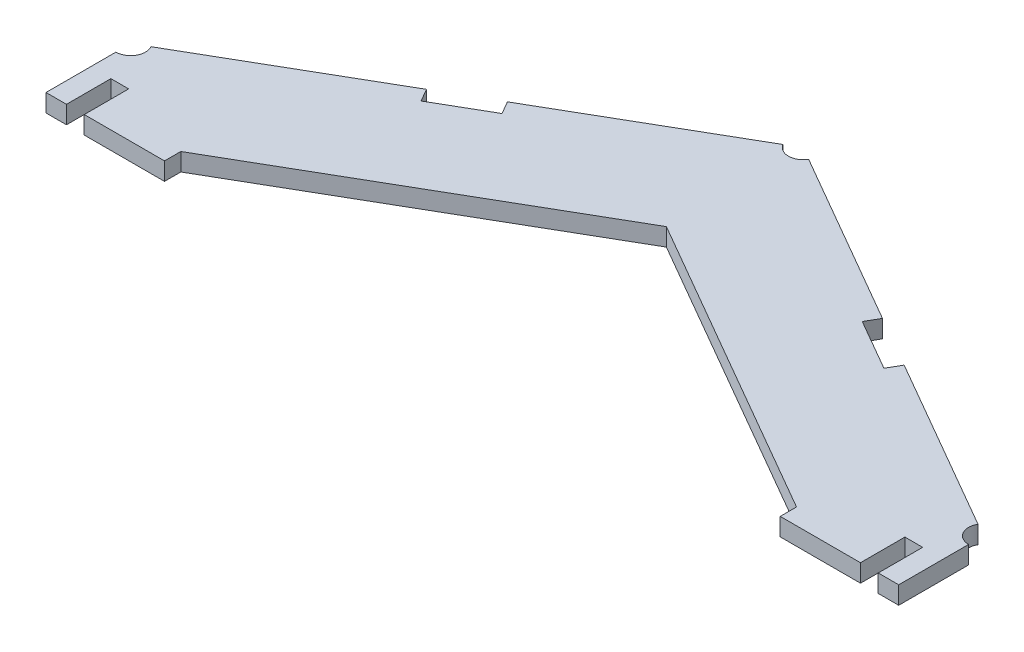
ISO-10303-21;
HEADER;
FILE_DESCRIPTION(('STEP AP214'),'2;1');
FILE_NAME('part.step','',(''),(''),'','','');
FILE_SCHEMA(('AUTOMOTIVE_DESIGN { 1 0 10303 214 1 1 1 1 }'));
ENDSEC;
DATA;
#1=APPLICATION_CONTEXT('core data for automotive mechanical design processes');
#2=APPLICATION_PROTOCOL_DEFINITION('international standard','automotive_design',2000,#1);
#3=PRODUCT_CONTEXT('',#1,'mechanical');
#4=PRODUCT('Part','Part','',(#3));
#5=PRODUCT_RELATED_PRODUCT_CATEGORY('part','',(#4));
#6=PRODUCT_DEFINITION_FORMATION('','',#4);
#7=PRODUCT_DEFINITION_CONTEXT('part definition',#1,'design');
#8=PRODUCT_DEFINITION('design','',#6,#7);
#9=PRODUCT_DEFINITION_SHAPE('','',#8);
#10=(LENGTH_UNIT() NAMED_UNIT(*) SI_UNIT(.MILLI.,.METRE.));
#11=(NAMED_UNIT(*) PLANE_ANGLE_UNIT() SI_UNIT($,.RADIAN.));
#12=(NAMED_UNIT(*) SI_UNIT($,.STERADIAN.) SOLID_ANGLE_UNIT());
#13=UNCERTAINTY_MEASURE_WITH_UNIT(LENGTH_MEASURE(1.E-05),#10,'distance_accuracy_value','');
#14=(GEOMETRIC_REPRESENTATION_CONTEXT(3) GLOBAL_UNCERTAINTY_ASSIGNED_CONTEXT((#13)) GLOBAL_UNIT_ASSIGNED_CONTEXT((#10,
#11,#12)) REPRESENTATION_CONTEXT('',''));
#15=CARTESIAN_POINT('',(0.,0.,0.));
#16=DIRECTION('',(0.,0.,1.));
#17=DIRECTION('',(1.,0.,0.));
#18=AXIS2_PLACEMENT_3D('',#15,#16,#17);
#19=CARTESIAN_POINT('',(-71.9715242270662,-36.,-27.25));
#20=DIRECTION('',(0.,-1.,0.));
#21=DIRECTION('',(0.,0.,-1.));
#22=AXIS2_PLACEMENT_3D('',#19,#20,#21);
#23=PLANE('',#22);
#24=DIRECTION('',(0.866025403784439,0.,0.5));
#25=VECTOR('',#24,1.);
#26=CARTESIAN_POINT('',(71.9615242270662,-36.,-41.5470053837925));
#27=LINE('',#26,#25);
#28=CARTESIAN_POINT('',(40.3108891324556,-36.,-59.8205080756885));
#29=VERTEX_POINT('',#28);
#30=CARTESIAN_POINT('',(69.7964607176053,-36.,-42.7970053837924));
#31=VERTEX_POINT('',#30);
#32=EDGE_CURVE('E468',#29,#31,#27,.T.);
#33=ORIENTED_EDGE('',*,*,#32,.F.);
#34=DIRECTION('',(0.500000000000006,0.,-0.866025403784435));
#35=VECTOR('',#34,1.);
#36=CARTESIAN_POINT('',(39.0608891324556,-36.,-57.6554445662274));
#37=LINE('',#36,#35);
#38=CARTESIAN_POINT('',(39.0608891324556,-36.,-57.6554445662274));
#39=VERTEX_POINT('',#38);
#40=EDGE_CURVE('E466',#39,#29,#37,.T.);
#41=ORIENTED_EDGE('',*,*,#40,.F.);
#42=DIRECTION('',(0.866025403784436,0.,0.500000000000005));
#43=VECTOR('',#42,1.);
#44=CARTESIAN_POINT('',(39.0608891324556,-36.,-57.6554445662274));
#45=LINE('',#44,#43);
#46=CARTESIAN_POINT('',(30.4006350946112,-36.,-62.6554445662274));
#47=VERTEX_POINT('',#46);
#48=EDGE_CURVE('E455',#47,#39,#45,.T.);
#49=ORIENTED_EDGE('',*,*,#48,.F.);
#50=DIRECTION('',(-0.500000000000005,0.,0.866025403784436));
#51=VECTOR('',#50,1.);
#52=CARTESIAN_POINT('',(30.4006350946112,-36.,-62.6554445662274));
#53=LINE('',#52,#51);
#54=CARTESIAN_POINT('',(31.6506350946112,-36.,-64.8205080756885));
#55=VERTEX_POINT('',#54);
#56=EDGE_CURVE('E462',#55,#47,#53,.T.);
#57=ORIENTED_EDGE('',*,*,#56,.F.);
#58=DIRECTION('',(0.866025403784439,0.,0.5));
#59=VECTOR('',#58,1.);
#60=CARTESIAN_POINT('',(71.9615242270662,-36.,-41.5470053837925));
#61=LINE('',#60,#59);
#62=CARTESIAN_POINT('',(2.1650635094611,-36.,-81.8440107675849));
#63=VERTEX_POINT('',#62);
#64=EDGE_CURVE('E464',#63,#55,#61,.T.);
#65=ORIENTED_EDGE('',*,*,#64,.F.);
#66=CARTESIAN_POINT('',(0.,-36.,-83.0940107675849));
#67=DIRECTION('',(0.,-1.,0.));
#68=DIRECTION('',(0.,0.,-1.));
#69=AXIS2_PLACEMENT_3D('',#66,#67,#68);
#70=CIRCLE('',#69,2.5);
#71=CARTESIAN_POINT('',(-2.16506350946109,-36.,-81.8440107675849));
#72=VERTEX_POINT('',#71);
#73=EDGE_CURVE('E473',#72,#63,#70,.F.);
#74=ORIENTED_EDGE('',*,*,#73,.F.);
#75=DIRECTION('',(0.866025403784439,0.,-0.5));
#76=VECTOR('',#75,1.);
#77=CARTESIAN_POINT('',(0.,-36.,-83.0940107675849));
#78=LINE('',#77,#76);
#79=CARTESIAN_POINT('',(-31.6506350946108,-36.,-64.8205080756888));
#80=VERTEX_POINT('',#79);
#81=EDGE_CURVE('E475',#80,#72,#78,.T.);
#82=ORIENTED_EDGE('',*,*,#81,.F.);
#83=DIRECTION('',(-0.499999999999999,0.,-0.866025403784439));
#84=VECTOR('',#83,1.);
#85=CARTESIAN_POINT('',(-30.4006350946108,-36.,-62.6554445662276));
#86=LINE('',#85,#84);
#87=CARTESIAN_POINT('',(-30.4006350946108,-36.,-62.6554445662276));
#88=VERTEX_POINT('',#87);
#89=EDGE_CURVE('E477',#88,#80,#86,.T.);
#90=ORIENTED_EDGE('',*,*,#89,.F.);
#91=DIRECTION('',(0.86602540378444,0.,-0.499999999999998));
#92=VECTOR('',#91,1.);
#93=CARTESIAN_POINT('',(-30.4006350946108,-36.,-62.6554445662276));
#94=LINE('',#93,#92);
#95=CARTESIAN_POINT('',(-39.0608891324552,-36.,-57.6554445662277));
#96=VERTEX_POINT('',#95);
#97=EDGE_CURVE('E479',#96,#88,#94,.T.);
#98=ORIENTED_EDGE('',*,*,#97,.F.);
#99=DIRECTION('',(0.499999999999999,0.,0.866025403784439));
#100=VECTOR('',#99,1.);
#101=CARTESIAN_POINT('',(-39.0608891324552,-36.,-57.6554445662277));
#102=LINE('',#101,#100);
#103=CARTESIAN_POINT('',(-40.3108891324552,-36.,-59.8205080756888));
#104=VERTEX_POINT('',#103);
#105=EDGE_CURVE('E481',#104,#96,#102,.T.);
#106=ORIENTED_EDGE('',*,*,#105,.F.);
#107=DIRECTION('',(0.866025403784439,0.,-0.5));
#108=VECTOR('',#107,1.);
#109=CARTESIAN_POINT('',(0.,-36.,-83.0940107675849));
#110=LINE('',#109,#108);
#111=CARTESIAN_POINT('',(-69.7964607176044,-36.,-42.7970053837929));
#112=VERTEX_POINT('',#111);
#113=EDGE_CURVE('E483',#112,#104,#110,.T.);
#114=ORIENTED_EDGE('',*,*,#113,.F.);
#115=CARTESIAN_POINT('',(-71.9615242270657,-36.,-41.5470053837933));
#116=DIRECTION('',(0.,-1.,0.));
#117=DIRECTION('',(0.,0.,-1.));
#118=AXIS2_PLACEMENT_3D('',#115,#116,#117);
#119=CIRCLE('',#118,2.5);
#120=CARTESIAN_POINT('',(-71.9615242270662,-36.,-39.0470053837933));
#121=VERTEX_POINT('',#120);
#122=EDGE_CURVE('E485',#121,#112,#119,.F.);
#123=ORIENTED_EDGE('',*,*,#122,.F.);
#124=DIRECTION('',(0.,0.,-1.));
#125=VECTOR('',#124,1.);
#126=CARTESIAN_POINT('',(-71.9615242270662,-36.,-41.5470053837925));
#127=LINE('',#126,#125);
#128=CARTESIAN_POINT('',(-71.9615242270662,-36.,-27.25));
#129=VERTEX_POINT('',#128);
#130=EDGE_CURVE('E334',#129,#121,#127,.T.);
#131=ORIENTED_EDGE('',*,*,#130,.F.);
#132=DIRECTION('',(1.,0.,0.));
#133=VECTOR('',#132,1.);
#134=CARTESIAN_POINT('',(-113.272742430532,-36.,-27.25));
#135=LINE('',#134,#133);
#136=CARTESIAN_POINT('',(-68.5064315060166,-36.,-27.25));
#137=VERTEX_POINT('',#136);
#138=EDGE_CURVE('E381',#129,#137,#135,.T.);
#139=ORIENTED_EDGE('',*,*,#138,.T.);
#140=DIRECTION('',(0.,0.,1.));
#141=VECTOR('',#140,1.);
#142=CARTESIAN_POINT('',(-68.5064315060166,-36.,-34.75));
#143=LINE('',#142,#141);
#144=CARTESIAN_POINT('',(-68.5064315060166,-36.,-34.75));
#145=VERTEX_POINT('',#144);
#146=EDGE_CURVE('E411',#145,#137,#143,.T.);
#147=ORIENTED_EDGE('',*,*,#146,.F.);
#148=DIRECTION('',(-1.,0.,0.));
#149=VECTOR('',#148,1.);
#150=CARTESIAN_POINT('',(-68.5064315060166,-36.,-34.75));
#151=LINE('',#150,#149);
#152=CARTESIAN_POINT('',(-65.5064315060166,-36.,-34.75));
#153=VERTEX_POINT('',#152);
#154=EDGE_CURVE('E414',#153,#145,#151,.T.);
#155=ORIENTED_EDGE('',*,*,#154,.F.);
#156=DIRECTION('',(0.,0.,-1.));
#157=VECTOR('',#156,1.);
#158=CARTESIAN_POINT('',(-65.5064315060166,-36.,-34.75));
#159=LINE('',#158,#157);
#160=CARTESIAN_POINT('',(-65.5064315060166,-36.,-27.25));
#161=VERTEX_POINT('',#160);
#162=EDGE_CURVE('E67',#161,#153,#159,.T.);
#163=ORIENTED_EDGE('',*,*,#162,.F.);
#164=DIRECTION('',(1.,0.,0.));
#165=VECTOR('',#164,1.);
#166=CARTESIAN_POINT('',(-113.272742430532,-36.,-27.25));
#167=LINE('',#166,#165);
#168=CARTESIAN_POINT('',(-51.9615242270664,-36.,-27.25));
#169=VERTEX_POINT('',#168);
#170=EDGE_CURVE('E60',#161,#169,#167,.T.);
#171=ORIENTED_EDGE('',*,*,#170,.T.);
#172=DIRECTION('',(0.,0.,-1.));
#173=VECTOR('',#172,1.);
#174=CARTESIAN_POINT('',(-51.9615242270663,-36.,29.9999999999999));
#175=LINE('',#174,#173);
#176=CARTESIAN_POINT('',(-51.9615242270664,-36.,-29.9999999999999));
#177=VERTEX_POINT('',#176);
#178=EDGE_CURVE('E285',#169,#177,#175,.T.);
#179=ORIENTED_EDGE('',*,*,#178,.T.);
#180=DIRECTION('',(0.866025403784439,0.,-0.499999999999999));
#181=VECTOR('',#180,1.);
#182=CARTESIAN_POINT('',(-51.9615242270664,-36.,-29.9999999999999));
#183=LINE('',#182,#181);
#184=CARTESIAN_POINT('',(0.,-36.,-59.9999999999999));
#185=VERTEX_POINT('',#184);
#186=EDGE_CURVE('E390',#177,#185,#183,.T.);
#187=ORIENTED_EDGE('',*,*,#186,.T.);
#188=DIRECTION('',(0.866025403784438,0.,0.500000000000001));
#189=VECTOR('',#188,1.);
#190=CARTESIAN_POINT('',(0.,-36.,-59.9999999999999));
#191=LINE('',#190,#189);
#192=CARTESIAN_POINT('',(51.9615242270662,-36.,-29.9999999999998));
#193=VERTEX_POINT('',#192);
#194=EDGE_CURVE('E392',#185,#193,#191,.T.);
#195=ORIENTED_EDGE('',*,*,#194,.T.);
#196=DIRECTION('',(0.,0.,1.));
#197=VECTOR('',#196,1.);
#198=CARTESIAN_POINT('',(51.9615242270662,-36.,-29.9999999999998));
#199=LINE('',#198,#197);
#200=CARTESIAN_POINT('',(51.9615242270662,-36.,-27.25));
#201=VERTEX_POINT('',#200);
#202=EDGE_CURVE('E47',#193,#201,#199,.T.);
#203=ORIENTED_EDGE('',*,*,#202,.T.);
#204=DIRECTION('',(1.,0.,0.));
#205=VECTOR('',#204,1.);
#206=CARTESIAN_POINT('',(-113.272742430532,-36.,-27.25));
#207=LINE('',#206,#205);
#208=CARTESIAN_POINT('',(65.5064315060166,-36.,-27.25));
#209=VERTEX_POINT('',#208);
#210=EDGE_CURVE('E384',#201,#209,#207,.T.);
#211=ORIENTED_EDGE('',*,*,#210,.T.);
#212=DIRECTION('',(0.,0.,1.));
#213=VECTOR('',#212,1.);
#214=CARTESIAN_POINT('',(65.5064315060166,-36.,-34.75));
#215=LINE('',#214,#213);
#216=CARTESIAN_POINT('',(65.5064315060166,-36.,-34.75));
#217=VERTEX_POINT('',#216);
#218=EDGE_CURVE('E409',#217,#209,#215,.T.);
#219=ORIENTED_EDGE('',*,*,#218,.F.);
#220=DIRECTION('',(-1.,0.,0.));
#221=VECTOR('',#220,1.);
#222=CARTESIAN_POINT('',(68.5064315060166,-36.,-34.75));
#223=LINE('',#222,#221);
#224=CARTESIAN_POINT('',(68.5064315060166,-36.,-34.75));
#225=VERTEX_POINT('',#224);
#226=EDGE_CURVE('E416',#225,#217,#223,.T.);
#227=ORIENTED_EDGE('',*,*,#226,.F.);
#228=DIRECTION('',(0.,0.,-1.));
#229=VECTOR('',#228,1.);
#230=CARTESIAN_POINT('',(68.5064315060166,-36.,-34.75));
#231=LINE('',#230,#229);
#232=CARTESIAN_POINT('',(68.5064315060166,-36.,-27.25));
#233=VERTEX_POINT('',#232);
#234=EDGE_CURVE('E412',#233,#225,#231,.T.);
#235=ORIENTED_EDGE('',*,*,#234,.F.);
#236=DIRECTION('',(1.,0.,0.));
#237=VECTOR('',#236,1.);
#238=CARTESIAN_POINT('',(-113.272742430532,-36.,-27.25));
#239=LINE('',#238,#237);
#240=CARTESIAN_POINT('',(71.9615242270662,-36.,-27.25));
#241=VERTEX_POINT('',#240);
#242=EDGE_CURVE('E327',#233,#241,#239,.T.);
#243=ORIENTED_EDGE('',*,*,#242,.T.);
#244=DIRECTION('',(0.,0.,1.));
#245=VECTOR('',#244,1.);
#246=CARTESIAN_POINT('',(71.9615242270662,-36.,41.5470053837925));
#247=LINE('',#246,#245);
#248=CARTESIAN_POINT('',(71.9615242270662,-36.,-39.0470053837923));
#249=VERTEX_POINT('',#248);
#250=EDGE_CURVE('E342',#249,#241,#247,.T.);
#251=ORIENTED_EDGE('',*,*,#250,.F.);
#252=CARTESIAN_POINT('',(71.9615242270663,-36.,-41.5470053837923));
#253=DIRECTION('',(0.,-1.,0.));
#254=DIRECTION('',(0.,0.,-1.));
#255=AXIS2_PLACEMENT_3D('',#252,#253,#254);
#256=CIRCLE('',#255,2.5);
#257=EDGE_CURVE('E252',#31,#249,#256,.F.);
#258=ORIENTED_EDGE('',*,*,#257,.F.);
#259=EDGE_LOOP('',(#33,#41,#49,#57,#65,#74,#82,#90,#98,#106,#114,#123,#131,#139,#147,#155,#163,
#171,#179,#187,#195,#203,#211,#219,#227,#235,#243,#251,#258));
#260=FACE_BOUND('',#259,.T.);
#261=ADVANCED_FACE('F43',(#260),#23,.F.);
#262=CARTESIAN_POINT('',(-71.9715242270662,-39.,-27.25));
#263=DIRECTION('',(0.,-1.,0.));
#264=DIRECTION('',(0.,0.,-1.));
#265=AXIS2_PLACEMENT_3D('',#262,#263,#264);
#266=PLANE('',#265);
#267=DIRECTION('',(0.866025403784439,0.,0.5));
#268=VECTOR('',#267,1.);
#269=CARTESIAN_POINT('',(71.9615242270662,-39.,-41.5470053837925));
#270=LINE('',#269,#268);
#271=CARTESIAN_POINT('',(40.3108891324556,-39.,-59.8205080756885));
#272=VERTEX_POINT('',#271);
#273=CARTESIAN_POINT('',(69.7964607176053,-39.,-42.7970053837924));
#274=VERTEX_POINT('',#273);
#275=EDGE_CURVE('E318',#272,#274,#270,.T.);
#276=ORIENTED_EDGE('',*,*,#275,.T.);
#277=CARTESIAN_POINT('',(71.9615242270663,-39.,-41.5470053837923));
#278=DIRECTION('',(0.,-1.,0.));
#279=DIRECTION('',(0.,0.,-1.));
#280=AXIS2_PLACEMENT_3D('',#277,#278,#279);
#281=CIRCLE('',#280,2.5);
#282=CARTESIAN_POINT('',(71.9615242270662,-39.,-39.0470053837923));
#283=VERTEX_POINT('',#282);
#284=EDGE_CURVE('E320',#274,#283,#281,.F.);
#285=ORIENTED_EDGE('',*,*,#284,.T.);
#286=DIRECTION('',(0.,0.,1.));
#287=VECTOR('',#286,1.);
#288=CARTESIAN_POINT('',(71.9615242270662,-39.,41.5470053837925));
#289=LINE('',#288,#287);
#290=CARTESIAN_POINT('',(71.9615242270662,-39.,-27.25));
#291=VERTEX_POINT('',#290);
#292=EDGE_CURVE('E278',#283,#291,#289,.T.);
#293=ORIENTED_EDGE('',*,*,#292,.T.);
#294=DIRECTION('',(1.,0.,0.));
#295=VECTOR('',#294,1.);
#296=CARTESIAN_POINT('',(-113.272742430532,-39.,-27.25));
#297=LINE('',#296,#295);
#298=CARTESIAN_POINT('',(68.5064315060166,-39.,-27.25));
#299=VERTEX_POINT('',#298);
#300=EDGE_CURVE('E323',#299,#291,#297,.T.);
#301=ORIENTED_EDGE('',*,*,#300,.F.);
#302=DIRECTION('',(0.,0.,-1.));
#303=VECTOR('',#302,1.);
#304=CARTESIAN_POINT('',(68.5064315060166,-39.,-34.75));
#305=LINE('',#304,#303);
#306=CARTESIAN_POINT('',(68.5064315060166,-39.,-34.75));
#307=VERTEX_POINT('',#306);
#308=EDGE_CURVE('E272',#299,#307,#305,.T.);
#309=ORIENTED_EDGE('',*,*,#308,.T.);
#310=DIRECTION('',(-1.,0.,0.));
#311=VECTOR('',#310,1.);
#312=CARTESIAN_POINT('',(68.5064315060166,-39.,-34.75));
#313=LINE('',#312,#311);
#314=CARTESIAN_POINT('',(65.5064315060166,-39.,-34.75));
#315=VERTEX_POINT('',#314);
#316=EDGE_CURVE('E275',#307,#315,#313,.T.);
#317=ORIENTED_EDGE('',*,*,#316,.T.);
#318=DIRECTION('',(0.,0.,1.));
#319=VECTOR('',#318,1.);
#320=CARTESIAN_POINT('',(65.5064315060166,-39.,-34.75));
#321=LINE('',#320,#319);
#322=CARTESIAN_POINT('',(65.5064315060166,-39.,-27.25));
#323=VERTEX_POINT('',#322);
#324=EDGE_CURVE('E269',#315,#323,#321,.T.);
#325=ORIENTED_EDGE('',*,*,#324,.T.);
#326=DIRECTION('',(1.,0.,0.));
#327=VECTOR('',#326,1.);
#328=CARTESIAN_POINT('',(-113.272742430532,-39.,-27.25));
#329=LINE('',#328,#327);
#330=CARTESIAN_POINT('',(51.9615242270662,-39.,-27.25));
#331=VERTEX_POINT('',#330);
#332=EDGE_CURVE('E253',#331,#323,#329,.T.);
#333=ORIENTED_EDGE('',*,*,#332,.F.);
#334=DIRECTION('',(0.,0.,1.));
#335=VECTOR('',#334,1.);
#336=CARTESIAN_POINT('',(51.9615242270662,-39.,-29.9999999999998));
#337=LINE('',#336,#335);
#338=CARTESIAN_POINT('',(51.9615242270662,-39.,-29.9999999999998));
#339=VERTEX_POINT('',#338);
#340=EDGE_CURVE('E340',#339,#331,#337,.T.);
#341=ORIENTED_EDGE('',*,*,#340,.F.);
#342=DIRECTION('',(0.866025403784438,0.,0.500000000000001));
#343=VECTOR('',#342,1.);
#344=CARTESIAN_POINT('',(0.,-39.,-59.9999999999999));
#345=LINE('',#344,#343);
#346=CARTESIAN_POINT('',(0.,-39.,-59.9999999999999));
#347=VERTEX_POINT('',#346);
#348=EDGE_CURVE('E337',#347,#339,#345,.T.);
#349=ORIENTED_EDGE('',*,*,#348,.F.);
#350=DIRECTION('',(0.866025403784439,0.,-0.499999999999999));
#351=VECTOR('',#350,1.);
#352=CARTESIAN_POINT('',(-51.9615242270664,-39.,-29.9999999999999));
#353=LINE('',#352,#351);
#354=CARTESIAN_POINT('',(-51.9615242270664,-39.,-29.9999999999999));
#355=VERTEX_POINT('',#354);
#356=EDGE_CURVE('E333',#355,#347,#353,.T.);
#357=ORIENTED_EDGE('',*,*,#356,.F.);
#358=DIRECTION('',(0.,0.,-1.));
#359=VECTOR('',#358,1.);
#360=CARTESIAN_POINT('',(-51.9615242270663,-39.,29.9999999999999));
#361=LINE('',#360,#359);
#362=CARTESIAN_POINT('',(-51.9615242270664,-39.,-27.25));
#363=VERTEX_POINT('',#362);
#364=EDGE_CURVE('E251',#363,#355,#361,.T.);
#365=ORIENTED_EDGE('',*,*,#364,.F.);
#366=DIRECTION('',(1.,0.,0.));
#367=VECTOR('',#366,1.);
#368=CARTESIAN_POINT('',(-113.272742430532,-39.,-27.25));
#369=LINE('',#368,#367);
#370=CARTESIAN_POINT('',(-65.5064315060166,-39.,-27.25));
#371=VERTEX_POINT('',#370);
#372=EDGE_CURVE('E238',#371,#363,#369,.T.);
#373=ORIENTED_EDGE('',*,*,#372,.F.);
#374=DIRECTION('',(0.,0.,-1.));
#375=VECTOR('',#374,1.);
#376=CARTESIAN_POINT('',(-65.5064315060166,-39.,-34.75));
#377=LINE('',#376,#375);
#378=CARTESIAN_POINT('',(-65.5064315060166,-39.,-34.75));
#379=VERTEX_POINT('',#378);
#380=EDGE_CURVE('E249',#371,#379,#377,.T.);
#381=ORIENTED_EDGE('',*,*,#380,.T.);
#382=DIRECTION('',(-1.,0.,0.));
#383=VECTOR('',#382,1.);
#384=CARTESIAN_POINT('',(-68.5064315060166,-39.,-34.75));
#385=LINE('',#384,#383);
#386=CARTESIAN_POINT('',(-68.5064315060166,-39.,-34.75));
#387=VERTEX_POINT('',#386);
#388=EDGE_CURVE('E259',#379,#387,#385,.T.);
#389=ORIENTED_EDGE('',*,*,#388,.T.);
#390=DIRECTION('',(0.,0.,1.));
#391=VECTOR('',#390,1.);
#392=CARTESIAN_POINT('',(-68.5064315060166,-39.,-34.75));
#393=LINE('',#392,#391);
#394=CARTESIAN_POINT('',(-68.5064315060166,-39.,-27.25));
#395=VERTEX_POINT('',#394);
#396=EDGE_CURVE('E261',#387,#395,#393,.T.);
#397=ORIENTED_EDGE('',*,*,#396,.T.);
#398=DIRECTION('',(1.,0.,0.));
#399=VECTOR('',#398,1.);
#400=CARTESIAN_POINT('',(-113.272742430532,-39.,-27.25));
#401=LINE('',#400,#399);
#402=CARTESIAN_POINT('',(-71.9615242270662,-39.,-27.25));
#403=VERTEX_POINT('',#402);
#404=EDGE_CURVE('E326',#403,#395,#401,.T.);
#405=ORIENTED_EDGE('',*,*,#404,.F.);
#406=DIRECTION('',(0.,0.,-1.));
#407=VECTOR('',#406,1.);
#408=CARTESIAN_POINT('',(-71.9615242270662,-39.,-41.5470053837925));
#409=LINE('',#408,#407);
#410=CARTESIAN_POINT('',(-71.9615242270662,-39.,-39.0470053837933));
#411=VERTEX_POINT('',#410);
#412=EDGE_CURVE('E281',#403,#411,#409,.T.);
#413=ORIENTED_EDGE('',*,*,#412,.T.);
#414=CARTESIAN_POINT('',(-71.9615242270657,-39.,-41.5470053837933));
#415=DIRECTION('',(0.,-1.,0.));
#416=DIRECTION('',(0.,0.,-1.));
#417=AXIS2_PLACEMENT_3D('',#414,#415,#416);
#418=CIRCLE('',#417,2.5);
#419=CARTESIAN_POINT('',(-69.7964607176044,-39.,-42.7970053837929));
#420=VERTEX_POINT('',#419);
#421=EDGE_CURVE('E284',#411,#420,#418,.F.);
#422=ORIENTED_EDGE('',*,*,#421,.T.);
#423=DIRECTION('',(0.866025403784439,0.,-0.5));
#424=VECTOR('',#423,1.);
#425=CARTESIAN_POINT('',(0.,-39.,-83.0940107675849));
#426=LINE('',#425,#424);
#427=CARTESIAN_POINT('',(-40.3108891324552,-39.,-59.8205080756888));
#428=VERTEX_POINT('',#427);
#429=EDGE_CURVE('E288',#420,#428,#426,.T.);
#430=ORIENTED_EDGE('',*,*,#429,.T.);
#431=DIRECTION('',(0.499999999999999,0.,0.866025403784439));
#432=VECTOR('',#431,1.);
#433=CARTESIAN_POINT('',(-39.0608891324552,-39.,-57.6554445662277));
#434=LINE('',#433,#432);
#435=CARTESIAN_POINT('',(-39.0608891324552,-39.,-57.6554445662277));
#436=VERTEX_POINT('',#435);
#437=EDGE_CURVE('E291',#428,#436,#434,.T.);
#438=ORIENTED_EDGE('',*,*,#437,.T.);
#439=DIRECTION('',(0.86602540378444,0.,-0.499999999999998));
#440=VECTOR('',#439,1.);
#441=CARTESIAN_POINT('',(-30.4006350946108,-39.,-62.6554445662276));
#442=LINE('',#441,#440);
#443=CARTESIAN_POINT('',(-30.4006350946108,-39.,-62.6554445662276));
#444=VERTEX_POINT('',#443);
#445=EDGE_CURVE('E294',#436,#444,#442,.T.);
#446=ORIENTED_EDGE('',*,*,#445,.T.);
#447=DIRECTION('',(-0.499999999999999,0.,-0.866025403784439));
#448=VECTOR('',#447,1.);
#449=CARTESIAN_POINT('',(-30.4006350946108,-39.,-62.6554445662276));
#450=LINE('',#449,#448);
#451=CARTESIAN_POINT('',(-31.6506350946108,-39.,-64.8205080756888));
#452=VERTEX_POINT('',#451);
#453=EDGE_CURVE('E297',#444,#452,#450,.T.);
#454=ORIENTED_EDGE('',*,*,#453,.T.);
#455=DIRECTION('',(0.866025403784439,0.,-0.5));
#456=VECTOR('',#455,1.);
#457=CARTESIAN_POINT('',(0.,-39.,-83.0940107675849));
#458=LINE('',#457,#456);
#459=CARTESIAN_POINT('',(-2.16506350946109,-39.,-81.8440107675849));
#460=VERTEX_POINT('',#459);
#461=EDGE_CURVE('E300',#452,#460,#458,.T.);
#462=ORIENTED_EDGE('',*,*,#461,.T.);
#463=CARTESIAN_POINT('',(0.,-39.,-83.0940107675849));
#464=DIRECTION('',(0.,-1.,0.));
#465=DIRECTION('',(0.,0.,-1.));
#466=AXIS2_PLACEMENT_3D('',#463,#464,#465);
#467=CIRCLE('',#466,2.5);
#468=CARTESIAN_POINT('',(2.1650635094611,-39.,-81.8440107675849));
#469=VERTEX_POINT('',#468);
#470=EDGE_CURVE('E303',#460,#469,#467,.F.);
#471=ORIENTED_EDGE('',*,*,#470,.T.);
#472=DIRECTION('',(0.866025403784439,0.,0.5));
#473=VECTOR('',#472,1.);
#474=CARTESIAN_POINT('',(71.9615242270662,-39.,-41.5470053837925));
#475=LINE('',#474,#473);
#476=CARTESIAN_POINT('',(31.6506350946112,-39.,-64.8205080756885));
#477=VERTEX_POINT('',#476);
#478=EDGE_CURVE('E306',#469,#477,#475,.T.);
#479=ORIENTED_EDGE('',*,*,#478,.T.);
#480=DIRECTION('',(-0.500000000000005,0.,0.866025403784436));
#481=VECTOR('',#480,1.);
#482=CARTESIAN_POINT('',(30.4006350946112,-39.,-62.6554445662274));
#483=LINE('',#482,#481);
#484=CARTESIAN_POINT('',(30.4006350946112,-39.,-62.6554445662274));
#485=VERTEX_POINT('',#484);
#486=EDGE_CURVE('E309',#477,#485,#483,.T.);
#487=ORIENTED_EDGE('',*,*,#486,.T.);
#488=DIRECTION('',(0.866025403784436,0.,0.500000000000005));
#489=VECTOR('',#488,1.);
#490=CARTESIAN_POINT('',(39.0608891324556,-39.,-57.6554445662274));
#491=LINE('',#490,#489);
#492=CARTESIAN_POINT('',(39.0608891324556,-39.,-57.6554445662274));
#493=VERTEX_POINT('',#492);
#494=EDGE_CURVE('E312',#485,#493,#491,.T.);
#495=ORIENTED_EDGE('',*,*,#494,.T.);
#496=DIRECTION('',(0.500000000000006,0.,-0.866025403784435));
#497=VECTOR('',#496,1.);
#498=CARTESIAN_POINT('',(39.0608891324556,-39.,-57.6554445662274));
#499=LINE('',#498,#497);
#500=EDGE_CURVE('E315',#493,#272,#499,.T.);
#501=ORIENTED_EDGE('',*,*,#500,.T.);
#502=EDGE_LOOP('',(#276,#285,#293,#301,#309,#317,#325,#333,#341,#349,#357,#365,#373,#381,#389,
#397,#405,#413,#422,#430,#438,#446,#454,#462,#471,#479,#487,#495,#501));
#503=FACE_BOUND('',#502,.T.);
#504=ADVANCED_FACE('F247',(#503),#266,.T.);
#505=CARTESIAN_POINT('',(71.9615242270662,9.,-41.5470053837925));
#506=DIRECTION('',(-0.5,0.,0.866025403784439));
#507=DIRECTION('',(0.866025403784439,0.,0.5));
#508=AXIS2_PLACEMENT_3D('',#505,#506,#507);
#509=PLANE('',#508);
#510=DIRECTION('',(0.,1.,0.));
#511=VECTOR('',#510,1.);
#512=CARTESIAN_POINT('',(40.3108891324556,9.,-59.8205080756885));
#513=LINE('',#512,#511);
#514=EDGE_CURVE('E366',#272,#29,#513,.T.);
#515=ORIENTED_EDGE('',*,*,#514,.T.);
#516=ORIENTED_EDGE('',*,*,#32,.T.);
#517=DIRECTION('',(0.,1.,0.));
#518=VECTOR('',#517,1.);
#519=CARTESIAN_POINT('',(69.7964607176053,-41.,-42.7970053837924));
#520=LINE('',#519,#518);
#521=EDGE_CURVE('E361',#31,#274,#520,.F.);
#522=ORIENTED_EDGE('',*,*,#521,.T.);
#523=ORIENTED_EDGE('',*,*,#275,.F.);
#524=EDGE_LOOP('',(#515,#516,#522,#523));
#525=FACE_BOUND('',#524,.T.);
#526=ADVANCED_FACE('F525',(#525),#509,.F.);
#527=CARTESIAN_POINT('',(39.0608891324556,-41.,-57.6554445662274));
#528=DIRECTION('',(0.866025403784435,0.,0.500000000000006));
#529=DIRECTION('',(0.500000000000006,0.,-0.866025403784435));
#530=AXIS2_PLACEMENT_3D('',#527,#528,#529);
#531=PLANE('',#530);
#532=DIRECTION('',(0.,1.,0.));
#533=VECTOR('',#532,1.);
#534=CARTESIAN_POINT('',(39.0608891324556,-41.,-57.6554445662274));
#535=LINE('',#534,#533);
#536=EDGE_CURVE('E446',#493,#39,#535,.T.);
#537=ORIENTED_EDGE('',*,*,#536,.T.);
#538=ORIENTED_EDGE('',*,*,#40,.T.);
#539=ORIENTED_EDGE('',*,*,#514,.F.);
#540=ORIENTED_EDGE('',*,*,#500,.F.);
#541=EDGE_LOOP('',(#537,#538,#539,#540));
#542=FACE_BOUND('',#541,.T.);
#543=ADVANCED_FACE('F533',(#542),#531,.F.);
#544=CARTESIAN_POINT('',(39.0608891324556,-41.,-57.6554445662274));
#545=DIRECTION('',(-0.500000000000005,0.,0.866025403784436));
#546=DIRECTION('',(0.866025403784436,0.,0.500000000000005));
#547=AXIS2_PLACEMENT_3D('',#544,#545,#546);
#548=PLANE('',#547);
#549=DIRECTION('',(0.,1.,0.));
#550=VECTOR('',#549,1.);
#551=CARTESIAN_POINT('',(30.4006350946112,-41.,-62.6554445662274));
#552=LINE('',#551,#550);
#553=EDGE_CURVE('E264',#485,#47,#552,.T.);
#554=ORIENTED_EDGE('',*,*,#553,.T.);
#555=ORIENTED_EDGE('',*,*,#48,.T.);
#556=ORIENTED_EDGE('',*,*,#536,.F.);
#557=ORIENTED_EDGE('',*,*,#494,.F.);
#558=EDGE_LOOP('',(#554,#555,#556,#557));
#559=FACE_BOUND('',#558,.T.);
#560=ADVANCED_FACE('F453',(#559),#548,.F.);
#561=CARTESIAN_POINT('',(30.4006350946112,-41.,-62.6554445662274));
#562=DIRECTION('',(-0.866025403784436,0.,-0.500000000000005));
#563=DIRECTION('',(-0.500000000000005,0.,0.866025403784436));
#564=AXIS2_PLACEMENT_3D('',#561,#562,#563);
#565=PLANE('',#564);
#566=DIRECTION('',(0.,-1.,0.));
#567=VECTOR('',#566,1.);
#568=CARTESIAN_POINT('',(31.6506350946112,9.,-64.8205080756885));
#569=LINE('',#568,#567);
#570=EDGE_CURVE('E364',#55,#477,#569,.T.);
#571=ORIENTED_EDGE('',*,*,#570,.F.);
#572=ORIENTED_EDGE('',*,*,#56,.T.);
#573=ORIENTED_EDGE('',*,*,#553,.F.);
#574=ORIENTED_EDGE('',*,*,#486,.F.);
#575=EDGE_LOOP('',(#571,#572,#573,#574));
#576=FACE_BOUND('',#575,.T.);
#577=ADVANCED_FACE('F460',(#576),#565,.F.);
#578=DIRECTION('',(0.,1.,0.));
#579=VECTOR('',#578,1.);
#580=CARTESIAN_POINT('',(2.1650635094611,-41.,-81.8440107675849));
#581=LINE('',#580,#579);
#582=EDGE_CURVE('E355',#469,#63,#581,.T.);
#583=ORIENTED_EDGE('',*,*,#582,.T.);
#584=ORIENTED_EDGE('',*,*,#64,.T.);
#585=ORIENTED_EDGE('',*,*,#570,.T.);
#586=ORIENTED_EDGE('',*,*,#478,.F.);
#587=EDGE_LOOP('',(#583,#584,#585,#586));
#588=FACE_BOUND('',#587,.T.);
#589=ADVANCED_FACE('F528',(#588),#509,.F.);
#590=CARTESIAN_POINT('',(0.,-41.,-83.0940107675849));
#591=DIRECTION('',(0.,1.,0.));
#592=DIRECTION('',(0.,0.,1.));
#593=AXIS2_PLACEMENT_3D('',#590,#591,#592);
#594=CYLINDRICAL_SURFACE('',#593,2.5);
#595=DIRECTION('',(0.,1.,0.));
#596=VECTOR('',#595,1.);
#597=CARTESIAN_POINT('',(-2.16506350946109,-41.,-81.8440107675849));
#598=LINE('',#597,#596);
#599=EDGE_CURVE('E356',#72,#460,#598,.F.);
#600=ORIENTED_EDGE('',*,*,#599,.F.);
#601=ORIENTED_EDGE('',*,*,#73,.T.);
#602=ORIENTED_EDGE('',*,*,#582,.F.);
#603=ORIENTED_EDGE('',*,*,#470,.F.);
#604=EDGE_LOOP('',(#600,#601,#602,#603));
#605=FACE_BOUND('',#604,.T.);
#606=ADVANCED_FACE('F531',(#605),#594,.F.);
#607=CARTESIAN_POINT('',(0.,9.,-83.0940107675849));
#608=DIRECTION('',(0.5,0.,0.866025403784439));
#609=DIRECTION('',(0.866025403784439,0.,-0.5));
#610=AXIS2_PLACEMENT_3D('',#607,#608,#609);
#611=PLANE('',#610);
#612=DIRECTION('',(0.,1.,0.));
#613=VECTOR('',#612,1.);
#614=CARTESIAN_POINT('',(-31.6506350946108,9.,-64.8205080756888));
#615=LINE('',#614,#613);
#616=EDGE_CURVE('E369',#452,#80,#615,.T.);
#617=ORIENTED_EDGE('',*,*,#616,.T.);
#618=ORIENTED_EDGE('',*,*,#81,.T.);
#619=ORIENTED_EDGE('',*,*,#599,.T.);
#620=ORIENTED_EDGE('',*,*,#461,.F.);
#621=EDGE_LOOP('',(#617,#618,#619,#620));
#622=FACE_BOUND('',#621,.T.);
#623=ADVANCED_FACE('F542',(#622),#611,.F.);
#624=CARTESIAN_POINT('',(-30.4006350946108,-41.,-62.6554445662276));
#625=DIRECTION('',(0.866025403784439,0.,-0.499999999999999));
#626=DIRECTION('',(-0.499999999999999,0.,-0.866025403784439));
#627=AXIS2_PLACEMENT_3D('',#624,#625,#626);
#628=PLANE('',#627);
#629=DIRECTION('',(0.,1.,0.));
#630=VECTOR('',#629,1.);
#631=CARTESIAN_POINT('',(-30.4006350946108,-41.,-62.6554445662276));
#632=LINE('',#631,#630);
#633=EDGE_CURVE('E444',#444,#88,#632,.T.);
#634=ORIENTED_EDGE('',*,*,#633,.T.);
#635=ORIENTED_EDGE('',*,*,#89,.T.);
#636=ORIENTED_EDGE('',*,*,#616,.F.);
#637=ORIENTED_EDGE('',*,*,#453,.F.);
#638=EDGE_LOOP('',(#634,#635,#636,#637));
#639=FACE_BOUND('',#638,.T.);
#640=ADVANCED_FACE('F549',(#639),#628,.F.);
#641=CARTESIAN_POINT('',(-30.4006350946108,-41.,-62.6554445662276));
#642=DIRECTION('',(0.499999999999998,0.,0.86602540378444));
#643=DIRECTION('',(0.86602540378444,0.,-0.499999999999998));
#644=AXIS2_PLACEMENT_3D('',#641,#642,#643);
#645=PLANE('',#644);
#646=DIRECTION('',(0.,1.,0.));
#647=VECTOR('',#646,1.);
#648=CARTESIAN_POINT('',(-39.0608891324552,-41.,-57.6554445662277));
#649=LINE('',#648,#647);
#650=EDGE_CURVE('E441',#436,#96,#649,.T.);
#651=ORIENTED_EDGE('',*,*,#650,.T.);
#652=ORIENTED_EDGE('',*,*,#97,.T.);
#653=ORIENTED_EDGE('',*,*,#633,.F.);
#654=ORIENTED_EDGE('',*,*,#445,.F.);
#655=EDGE_LOOP('',(#651,#652,#653,#654));
#656=FACE_BOUND('',#655,.T.);
#657=ADVANCED_FACE('F552',(#656),#645,.F.);
#658=CARTESIAN_POINT('',(-39.0608891324552,-41.,-57.6554445662277));
#659=DIRECTION('',(-0.866025403784439,0.,0.499999999999999));
#660=DIRECTION('',(0.499999999999999,0.,0.866025403784439));
#661=AXIS2_PLACEMENT_3D('',#658,#659,#660);
#662=PLANE('',#661);
#663=DIRECTION('',(0.,-1.,0.));
#664=VECTOR('',#663,1.);
#665=CARTESIAN_POINT('',(-40.3108891324552,9.,-59.8205080756888));
#666=LINE('',#665,#664);
#667=EDGE_CURVE('E367',#104,#428,#666,.T.);
#668=ORIENTED_EDGE('',*,*,#667,.F.);
#669=ORIENTED_EDGE('',*,*,#105,.T.);
#670=ORIENTED_EDGE('',*,*,#650,.F.);
#671=ORIENTED_EDGE('',*,*,#437,.F.);
#672=EDGE_LOOP('',(#668,#669,#670,#671));
#673=FACE_BOUND('',#672,.T.);
#674=ADVANCED_FACE('F547',(#673),#662,.F.);
#675=DIRECTION('',(0.,1.,0.));
#676=VECTOR('',#675,1.);
#677=CARTESIAN_POINT('',(-69.7964607176044,-41.,-42.7970053837929));
#678=LINE('',#677,#676);
#679=EDGE_CURVE('E358',#420,#112,#678,.T.);
#680=ORIENTED_EDGE('',*,*,#679,.T.);
#681=ORIENTED_EDGE('',*,*,#113,.T.);
#682=ORIENTED_EDGE('',*,*,#667,.T.);
#683=ORIENTED_EDGE('',*,*,#429,.F.);
#684=EDGE_LOOP('',(#680,#681,#682,#683));
#685=FACE_BOUND('',#684,.T.);
#686=ADVANCED_FACE('F544',(#685),#611,.F.);
#687=CARTESIAN_POINT('',(-71.9615242270657,-41.,-41.5470053837933));
#688=DIRECTION('',(0.,1.,0.));
#689=DIRECTION('',(0.,0.,1.));
#690=AXIS2_PLACEMENT_3D('',#687,#688,#689);
#691=CYLINDRICAL_SURFACE('',#690,2.5);
#692=DIRECTION('',(0.,1.,0.));
#693=VECTOR('',#692,1.);
#694=CARTESIAN_POINT('',(-71.9615242270662,-41.,-39.0470053837933));
#695=LINE('',#694,#693);
#696=EDGE_CURVE('E359',#121,#411,#695,.F.);
#697=ORIENTED_EDGE('',*,*,#696,.F.);
#698=ORIENTED_EDGE('',*,*,#122,.T.);
#699=ORIENTED_EDGE('',*,*,#679,.F.);
#700=ORIENTED_EDGE('',*,*,#421,.F.);
#701=EDGE_LOOP('',(#697,#698,#699,#700));
#702=FACE_BOUND('',#701,.T.);
#703=ADVANCED_FACE('F498',(#702),#691,.F.);
#704=CARTESIAN_POINT('',(-113.272742430532,-42.01,-27.25));
#705=DIRECTION('',(0.,0.,1.));
#706=DIRECTION('',(1.,0.,0.));
#707=AXIS2_PLACEMENT_3D('',#704,#705,#706);
#708=PLANE('',#707);
#709=ORIENTED_EDGE('',*,*,#138,.F.);
#710=DIRECTION('',(0.,-1.,0.));
#711=VECTOR('',#710,1.);
#712=CARTESIAN_POINT('',(-71.9615242270662,9.,-27.25));
#713=LINE('',#712,#711);
#714=EDGE_CURVE('E348',#129,#403,#713,.T.);
#715=ORIENTED_EDGE('',*,*,#714,.T.);
#716=ORIENTED_EDGE('',*,*,#404,.T.);
#717=DIRECTION('',(0.,-1.,0.));
#718=VECTOR('',#717,1.);
#719=CARTESIAN_POINT('',(-68.5064315060166,-42.01,-27.25));
#720=LINE('',#719,#718);
#721=EDGE_CURVE('E242',#137,#395,#720,.T.);
#722=ORIENTED_EDGE('',*,*,#721,.F.);
#723=EDGE_LOOP('',(#709,#715,#716,#722));
#724=FACE_BOUND('',#723,.T.);
#725=ADVANCED_FACE('F504',(#724),#708,.T.);
#726=CARTESIAN_POINT('',(-68.5064315060166,-51.,-34.75));
#727=DIRECTION('',(-1.,0.,0.));
#728=DIRECTION('',(0.,0.,1.));
#729=AXIS2_PLACEMENT_3D('',#726,#727,#728);
#730=PLANE('',#729);
#731=DIRECTION('',(0.,1.,0.));
#732=VECTOR('',#731,1.);
#733=CARTESIAN_POINT('',(-68.5064315060166,-51.,-34.75));
#734=LINE('',#733,#732);
#735=EDGE_CURVE('E345',#387,#145,#734,.T.);
#736=ORIENTED_EDGE('',*,*,#735,.T.);
#737=ORIENTED_EDGE('',*,*,#146,.T.);
#738=ORIENTED_EDGE('',*,*,#721,.T.);
#739=ORIENTED_EDGE('',*,*,#396,.F.);
#740=EDGE_LOOP('',(#736,#737,#738,#739));
#741=FACE_BOUND('',#740,.T.);
#742=ADVANCED_FACE('F507',(#741),#730,.F.);
#743=CARTESIAN_POINT('',(-68.5064315060166,-51.,-34.75));
#744=DIRECTION('',(0.,0.,-1.));
#745=DIRECTION('',(-1.,0.,0.));
#746=AXIS2_PLACEMENT_3D('',#743,#744,#745);
#747=PLANE('',#746);
#748=DIRECTION('',(0.,1.,0.));
#749=VECTOR('',#748,1.);
#750=CARTESIAN_POINT('',(-65.5064315060166,-51.,-34.75));
#751=LINE('',#750,#749);
#752=EDGE_CURVE('E257',#379,#153,#751,.T.);
#753=ORIENTED_EDGE('',*,*,#752,.T.);
#754=ORIENTED_EDGE('',*,*,#154,.T.);
#755=ORIENTED_EDGE('',*,*,#735,.F.);
#756=ORIENTED_EDGE('',*,*,#388,.F.);
#757=EDGE_LOOP('',(#753,#754,#755,#756));
#758=FACE_BOUND('',#757,.T.);
#759=ADVANCED_FACE('F509',(#758),#747,.F.);
#760=ORIENTED_EDGE('',*,*,#170,.F.);
#761=DIRECTION('',(0.,1.,0.));
#762=VECTOR('',#761,1.);
#763=CARTESIAN_POINT('',(-65.5064315060166,-42.01,-27.25));
#764=LINE('',#763,#762);
#765=EDGE_CURVE('E235',#371,#161,#764,.T.);
#766=ORIENTED_EDGE('',*,*,#765,.F.);
#767=ORIENTED_EDGE('',*,*,#372,.T.);
#768=DIRECTION('',(0.,-1.,0.));
#769=VECTOR('',#768,1.);
#770=CARTESIAN_POINT('',(-51.9615242270664,-33.,-27.25));
#771=LINE('',#770,#769);
#772=EDGE_CURVE('E353',#169,#363,#771,.T.);
#773=ORIENTED_EDGE('',*,*,#772,.F.);
#774=EDGE_LOOP('',(#760,#766,#767,#773));
#775=FACE_BOUND('',#774,.T.);
#776=ADVANCED_FACE('F237',(#775),#708,.T.);
#777=CARTESIAN_POINT('',(-65.5064315060166,-51.,-34.75));
#778=DIRECTION('',(1.,0.,0.));
#779=DIRECTION('',(0.,0.,-1.));
#780=AXIS2_PLACEMENT_3D('',#777,#778,#779);
#781=PLANE('',#780);
#782=ORIENTED_EDGE('',*,*,#765,.T.);
#783=ORIENTED_EDGE('',*,*,#162,.T.);
#784=ORIENTED_EDGE('',*,*,#752,.F.);
#785=ORIENTED_EDGE('',*,*,#380,.F.);
#786=EDGE_LOOP('',(#782,#783,#784,#785));
#787=FACE_BOUND('',#786,.T.);
#788=ADVANCED_FACE('F255',(#787),#781,.F.);
#789=CARTESIAN_POINT('',(-51.9615242270663,-33.,29.9999999999999));
#790=DIRECTION('',(1.,0.,0.));
#791=DIRECTION('',(0.,0.,-1.));
#792=AXIS2_PLACEMENT_3D('',#789,#790,#791);
#793=PLANE('',#792);
#794=ORIENTED_EDGE('',*,*,#178,.F.);
#795=ORIENTED_EDGE('',*,*,#772,.T.);
#796=ORIENTED_EDGE('',*,*,#364,.T.);
#797=DIRECTION('',(0.,1.,0.));
#798=VECTOR('',#797,1.);
#799=CARTESIAN_POINT('',(-51.9615242270664,-33.,-29.9999999999999));
#800=LINE('',#799,#798);
#801=EDGE_CURVE('E373',#355,#177,#800,.T.);
#802=ORIENTED_EDGE('',*,*,#801,.T.);
#803=EDGE_LOOP('',(#794,#795,#796,#802));
#804=FACE_BOUND('',#803,.T.);
#805=ADVANCED_FACE('F580',(#804),#793,.T.);
#806=CARTESIAN_POINT('',(-51.9615242270664,-33.,-29.9999999999999));
#807=DIRECTION('',(0.499999999999999,0.,0.866025403784439));
#808=DIRECTION('',(0.866025403784439,0.,-0.499999999999999));
#809=AXIS2_PLACEMENT_3D('',#806,#807,#808);
#810=PLANE('',#809);
#811=ORIENTED_EDGE('',*,*,#186,.F.);
#812=ORIENTED_EDGE('',*,*,#801,.F.);
#813=ORIENTED_EDGE('',*,*,#356,.T.);
#814=DIRECTION('',(0.,1.,0.));
#815=VECTOR('',#814,1.);
#816=CARTESIAN_POINT('',(0.,-42.,-59.9999999999999));
#817=LINE('',#816,#815);
#818=EDGE_CURVE('E376',#347,#185,#817,.T.);
#819=ORIENTED_EDGE('',*,*,#818,.T.);
#820=EDGE_LOOP('',(#811,#812,#813,#819));
#821=FACE_BOUND('',#820,.T.);
#822=ADVANCED_FACE('F573',(#821),#810,.T.);
#823=ORIENTED_EDGE('',*,*,#210,.F.);
#824=DIRECTION('',(0.,1.,0.));
#825=VECTOR('',#824,1.);
#826=CARTESIAN_POINT('',(51.9615242270662,-33.,-27.25));
#827=LINE('',#826,#825);
#828=EDGE_CURVE('E350',#331,#201,#827,.T.);
#829=ORIENTED_EDGE('',*,*,#828,.F.);
#830=ORIENTED_EDGE('',*,*,#332,.T.);
#831=DIRECTION('',(0.,-1.,0.));
#832=VECTOR('',#831,1.);
#833=CARTESIAN_POINT('',(65.5064315060166,-42.01,-27.25));
#834=LINE('',#833,#832);
#835=EDGE_CURVE('E343',#209,#323,#834,.T.);
#836=ORIENTED_EDGE('',*,*,#835,.F.);
#837=EDGE_LOOP('',(#823,#829,#830,#836));
#838=FACE_BOUND('',#837,.T.);
#839=ADVANCED_FACE('F404',(#838),#708,.T.);
#840=CARTESIAN_POINT('',(68.5064315060166,-51.,-34.75));
#841=DIRECTION('',(0.,0.,-1.));
#842=DIRECTION('',(-1.,0.,0.));
#843=AXIS2_PLACEMENT_3D('',#840,#841,#842);
#844=PLANE('',#843);
#845=DIRECTION('',(0.,1.,0.));
#846=VECTOR('',#845,1.);
#847=CARTESIAN_POINT('',(68.5064315060166,-51.,-34.75));
#848=LINE('',#847,#846);
#849=EDGE_CURVE('E11',#307,#225,#848,.T.);
#850=ORIENTED_EDGE('',*,*,#849,.T.);
#851=ORIENTED_EDGE('',*,*,#226,.T.);
#852=DIRECTION('',(0.,1.,0.));
#853=VECTOR('',#852,1.);
#854=CARTESIAN_POINT('',(65.5064315060166,-51.,-34.75));
#855=LINE('',#854,#853);
#856=EDGE_CURVE('E52',#315,#217,#855,.T.);
#857=ORIENTED_EDGE('',*,*,#856,.F.);
#858=ORIENTED_EDGE('',*,*,#316,.F.);
#859=EDGE_LOOP('',(#850,#851,#857,#858));
#860=FACE_BOUND('',#859,.T.);
#861=ADVANCED_FACE('F572',(#860),#844,.F.);
#862=CARTESIAN_POINT('',(65.5064315060166,-51.,-34.75));
#863=DIRECTION('',(-1.,0.,0.));
#864=DIRECTION('',(0.,0.,1.));
#865=AXIS2_PLACEMENT_3D('',#862,#863,#864);
#866=PLANE('',#865);
#867=ORIENTED_EDGE('',*,*,#856,.T.);
#868=ORIENTED_EDGE('',*,*,#218,.T.);
#869=ORIENTED_EDGE('',*,*,#835,.T.);
#870=ORIENTED_EDGE('',*,*,#324,.F.);
#871=EDGE_LOOP('',(#867,#868,#869,#870));
#872=FACE_BOUND('',#871,.T.);
#873=ADVANCED_FACE('F408',(#872),#866,.F.);
#874=ORIENTED_EDGE('',*,*,#242,.F.);
#875=DIRECTION('',(0.,1.,0.));
#876=VECTOR('',#875,1.);
#877=CARTESIAN_POINT('',(68.5064315060166,-42.01,-27.25));
#878=LINE('',#877,#876);
#879=EDGE_CURVE('E241',#299,#233,#878,.T.);
#880=ORIENTED_EDGE('',*,*,#879,.F.);
#881=ORIENTED_EDGE('',*,*,#300,.T.);
#882=DIRECTION('',(0.,1.,0.));
#883=VECTOR('',#882,1.);
#884=CARTESIAN_POINT('',(71.9615242270662,9.,-27.25));
#885=LINE('',#884,#883);
#886=EDGE_CURVE('E347',#291,#241,#885,.T.);
#887=ORIENTED_EDGE('',*,*,#886,.T.);
#888=EDGE_LOOP('',(#874,#880,#881,#887));
#889=FACE_BOUND('',#888,.T.);
#890=ADVANCED_FACE('F517',(#889),#708,.T.);
#891=CARTESIAN_POINT('',(68.5064315060166,-51.,-34.75));
#892=DIRECTION('',(1.,0.,0.));
#893=DIRECTION('',(0.,0.,-1.));
#894=AXIS2_PLACEMENT_3D('',#891,#892,#893);
#895=PLANE('',#894);
#896=ORIENTED_EDGE('',*,*,#879,.T.);
#897=ORIENTED_EDGE('',*,*,#234,.T.);
#898=ORIENTED_EDGE('',*,*,#849,.F.);
#899=ORIENTED_EDGE('',*,*,#308,.F.);
#900=EDGE_LOOP('',(#896,#897,#898,#899));
#901=FACE_BOUND('',#900,.T.);
#902=ADVANCED_FACE('F569',(#901),#895,.F.);
#903=CARTESIAN_POINT('',(71.9615242270663,-41.,-41.5470053837923));
#904=DIRECTION('',(0.,1.,0.));
#905=DIRECTION('',(0.,0.,1.));
#906=AXIS2_PLACEMENT_3D('',#903,#904,#905);
#907=CYLINDRICAL_SURFACE('',#906,2.5);
#908=ORIENTED_EDGE('',*,*,#521,.F.);
#909=ORIENTED_EDGE('',*,*,#257,.T.);
#910=DIRECTION('',(0.,1.,0.));
#911=VECTOR('',#910,1.);
#912=CARTESIAN_POINT('',(71.9615242270662,-41.,-39.0470053837923));
#913=LINE('',#912,#911);
#914=EDGE_CURVE('E363',#283,#249,#913,.T.);
#915=ORIENTED_EDGE('',*,*,#914,.F.);
#916=ORIENTED_EDGE('',*,*,#284,.F.);
#917=EDGE_LOOP('',(#908,#909,#915,#916));
#918=FACE_BOUND('',#917,.T.);
#919=ADVANCED_FACE('F595',(#918),#907,.F.);
#920=CARTESIAN_POINT('',(71.9615242270662,9.,41.5470053837925));
#921=DIRECTION('',(-1.,0.,0.));
#922=DIRECTION('',(0.,0.,1.));
#923=AXIS2_PLACEMENT_3D('',#920,#921,#922);
#924=PLANE('',#923);
#925=ORIENTED_EDGE('',*,*,#914,.T.);
#926=ORIENTED_EDGE('',*,*,#250,.T.);
#927=ORIENTED_EDGE('',*,*,#886,.F.);
#928=ORIENTED_EDGE('',*,*,#292,.F.);
#929=EDGE_LOOP('',(#925,#926,#927,#928));
#930=FACE_BOUND('',#929,.T.);
#931=ADVANCED_FACE('F589',(#930),#924,.F.);
#932=CARTESIAN_POINT('',(0.,-33.,-59.9999999999999));
#933=DIRECTION('',(-0.500000000000001,0.,0.866025403784438));
#934=DIRECTION('',(0.866025403784438,0.,0.500000000000001));
#935=AXIS2_PLACEMENT_3D('',#932,#933,#934);
#936=PLANE('',#935);
#937=ORIENTED_EDGE('',*,*,#194,.F.);
#938=ORIENTED_EDGE('',*,*,#818,.F.);
#939=ORIENTED_EDGE('',*,*,#348,.T.);
#940=DIRECTION('',(0.,1.,0.));
#941=VECTOR('',#940,1.);
#942=CARTESIAN_POINT('',(51.9615242270662,-33.,-29.9999999999998));
#943=LINE('',#942,#941);
#944=EDGE_CURVE('E370',#339,#193,#943,.T.);
#945=ORIENTED_EDGE('',*,*,#944,.T.);
#946=EDGE_LOOP('',(#937,#938,#939,#945));
#947=FACE_BOUND('',#946,.T.);
#948=ADVANCED_FACE('F587',(#947),#936,.T.);
#949=CARTESIAN_POINT('',(51.9615242270662,-33.,-29.9999999999998));
#950=DIRECTION('',(-1.,0.,0.));
#951=DIRECTION('',(0.,0.,1.));
#952=AXIS2_PLACEMENT_3D('',#949,#950,#951);
#953=PLANE('',#952);
#954=ORIENTED_EDGE('',*,*,#202,.F.);
#955=ORIENTED_EDGE('',*,*,#944,.F.);
#956=ORIENTED_EDGE('',*,*,#340,.T.);
#957=ORIENTED_EDGE('',*,*,#828,.T.);
#958=EDGE_LOOP('',(#954,#955,#956,#957));
#959=FACE_BOUND('',#958,.T.);
#960=ADVANCED_FACE('F45',(#959),#953,.T.);
#961=CARTESIAN_POINT('',(-71.9615242270662,9.,-41.5470053837925));
#962=DIRECTION('',(1.,0.,0.));
#963=DIRECTION('',(0.,0.,-1.));
#964=AXIS2_PLACEMENT_3D('',#961,#962,#963);
#965=PLANE('',#964);
#966=ORIENTED_EDGE('',*,*,#714,.F.);
#967=ORIENTED_EDGE('',*,*,#130,.T.);
#968=ORIENTED_EDGE('',*,*,#696,.T.);
#969=ORIENTED_EDGE('',*,*,#412,.F.);
#970=EDGE_LOOP('',(#966,#967,#968,#969));
#971=FACE_BOUND('',#970,.T.);
#972=ADVANCED_FACE('F491',(#971),#965,.F.);
#973=CLOSED_SHELL('',(#261,#504,#526,#543,#560,#577,#589,#606,#623,#640,#657,#674,#686,#703,
#725,#742,#759,#776,#788,#805,#822,#839,#861,#873,#890,#902,#919,#931,#948,#960,#972));
#974=MANIFOLD_SOLID_BREP('B2',#973);
#975=ADVANCED_BREP_SHAPE_REPRESENTATION('',(#18,#974),#14);
#976=SHAPE_DEFINITION_REPRESENTATION(#9,#975);
ENDSEC;
END-ISO-10303-21;
